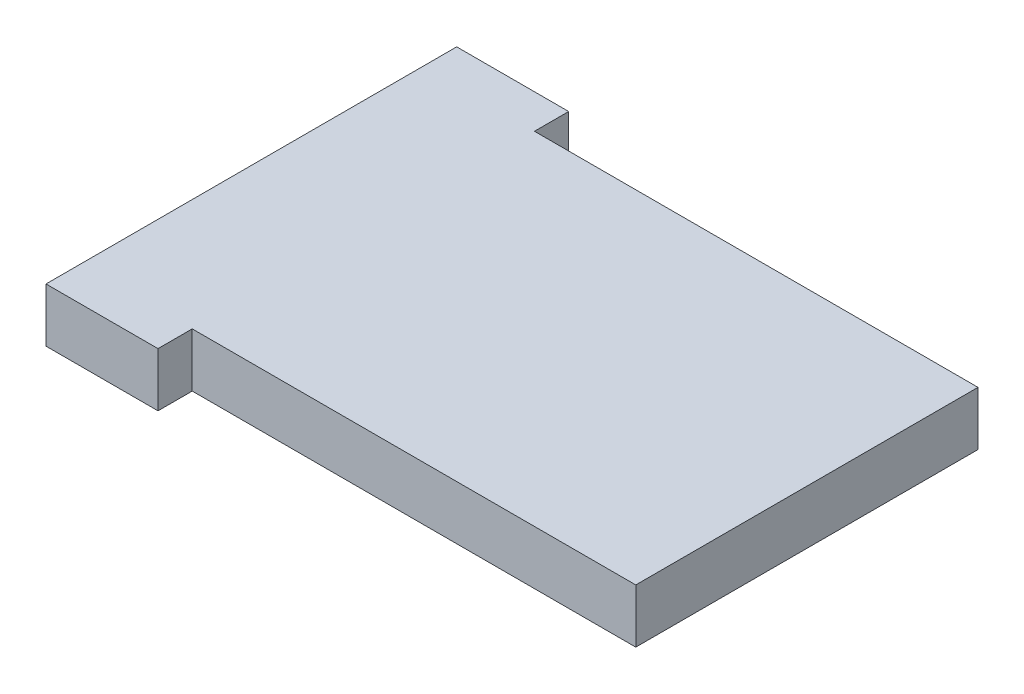
ISO-10303-21;
HEADER;
FILE_DESCRIPTION(('STEP AP214'),'2;1');
FILE_NAME('part.step','',(''),(''),'','','');
FILE_SCHEMA(('AUTOMOTIVE_DESIGN { 1 0 10303 214 1 1 1 1 }'));
ENDSEC;
DATA;
#1=APPLICATION_CONTEXT('core data for automotive mechanical design processes');
#2=APPLICATION_PROTOCOL_DEFINITION('international standard','automotive_design',2000,#1);
#3=PRODUCT_CONTEXT('',#1,'mechanical');
#4=PRODUCT('Part','Part','',(#3));
#5=PRODUCT_RELATED_PRODUCT_CATEGORY('part','',(#4));
#6=PRODUCT_DEFINITION_FORMATION('','',#4);
#7=PRODUCT_DEFINITION_CONTEXT('part definition',#1,'design');
#8=PRODUCT_DEFINITION('design','',#6,#7);
#9=PRODUCT_DEFINITION_SHAPE('','',#8);
#10=(LENGTH_UNIT() NAMED_UNIT(*) SI_UNIT(.MILLI.,.METRE.));
#11=(NAMED_UNIT(*) PLANE_ANGLE_UNIT() SI_UNIT($,.RADIAN.));
#12=(NAMED_UNIT(*) SI_UNIT($,.STERADIAN.) SOLID_ANGLE_UNIT());
#13=UNCERTAINTY_MEASURE_WITH_UNIT(LENGTH_MEASURE(1.E-05),#10,'distance_accuracy_value','');
#14=(GEOMETRIC_REPRESENTATION_CONTEXT(3) GLOBAL_UNCERTAINTY_ASSIGNED_CONTEXT((#13)) GLOBAL_UNIT_ASSIGNED_CONTEXT((#10,
#11,#12)) REPRESENTATION_CONTEXT('',''));
#15=CARTESIAN_POINT('',(0.,0.,0.));
#16=DIRECTION('',(0.,0.,1.));
#17=DIRECTION('',(1.,0.,0.));
#18=AXIS2_PLACEMENT_3D('',#15,#16,#17);
#19=CARTESIAN_POINT('',(10.3910665813114,5.,-19.05));
#20=DIRECTION('',(0.,0.,1.));
#21=DIRECTION('',(1.,0.,0.));
#22=AXIS2_PLACEMENT_3D('',#19,#20,#21);
#23=PLANE('',#22);
#24=DIRECTION('',(-1.,0.,0.));
#25=VECTOR('',#24,1.);
#26=CARTESIAN_POINT('',(10.3910665813114,0.,-19.05));
#27=LINE('',#26,#25);
#28=CARTESIAN_POINT('',(10.3910665813114,0.,-19.05));
#29=VERTEX_POINT('',#28);
#30=CARTESIAN_POINT('',(0.,0.,-19.05));
#31=VERTEX_POINT('',#30);
#32=EDGE_CURVE('E129',#29,#31,#27,.T.);
#33=ORIENTED_EDGE('',*,*,#32,.T.);
#34=DIRECTION('',(0.,-1.,0.));
#35=VECTOR('',#34,1.);
#36=CARTESIAN_POINT('',(0.,5.,-19.05));
#37=LINE('',#36,#35);
#38=CARTESIAN_POINT('',(0.,5.,-19.05));
#39=VERTEX_POINT('',#38);
#40=EDGE_CURVE('E11',#39,#31,#37,.T.);
#41=ORIENTED_EDGE('',*,*,#40,.F.);
#42=DIRECTION('',(-1.,0.,0.));
#43=VECTOR('',#42,1.);
#44=CARTESIAN_POINT('',(10.3910665813114,5.,-19.05));
#45=LINE('',#44,#43);
#46=CARTESIAN_POINT('',(10.3910665813114,5.,-19.05));
#47=VERTEX_POINT('',#46);
#48=EDGE_CURVE('E143',#47,#39,#45,.T.);
#49=ORIENTED_EDGE('',*,*,#48,.F.);
#50=DIRECTION('',(0.,-1.,0.));
#51=VECTOR('',#50,1.);
#52=CARTESIAN_POINT('',(10.3910665813114,5.,-19.05));
#53=LINE('',#52,#51);
#54=EDGE_CURVE('E125',#47,#29,#53,.T.);
#55=ORIENTED_EDGE('',*,*,#54,.T.);
#56=EDGE_LOOP('',(#33,#41,#49,#55));
#57=FACE_BOUND('',#56,.T.);
#58=ADVANCED_FACE('F33',(#57),#23,.F.);
#59=CARTESIAN_POINT('',(0.,5.,-19.05));
#60=DIRECTION('',(1.,0.,0.));
#61=DIRECTION('',(0.,0.,-1.));
#62=AXIS2_PLACEMENT_3D('',#59,#60,#61);
#63=PLANE('',#62);
#64=DIRECTION('',(0.,0.,1.));
#65=VECTOR('',#64,1.);
#66=CARTESIAN_POINT('',(0.,0.,-19.05));
#67=LINE('',#66,#65);
#68=CARTESIAN_POINT('',(0.,0.,19.05));
#69=VERTEX_POINT('',#68);
#70=EDGE_CURVE('E132',#31,#69,#67,.T.);
#71=ORIENTED_EDGE('',*,*,#70,.T.);
#72=DIRECTION('',(0.,-1.,0.));
#73=VECTOR('',#72,1.);
#74=CARTESIAN_POINT('',(0.,5.,19.05));
#75=LINE('',#74,#73);
#76=CARTESIAN_POINT('',(0.,5.,19.05));
#77=VERTEX_POINT('',#76);
#78=EDGE_CURVE('E41',#77,#69,#75,.T.);
#79=ORIENTED_EDGE('',*,*,#78,.F.);
#80=DIRECTION('',(0.,0.,1.));
#81=VECTOR('',#80,1.);
#82=CARTESIAN_POINT('',(0.,5.,-19.05));
#83=LINE('',#82,#81);
#84=EDGE_CURVE('E92',#39,#77,#83,.T.);
#85=ORIENTED_EDGE('',*,*,#84,.F.);
#86=ORIENTED_EDGE('',*,*,#40,.T.);
#87=EDGE_LOOP('',(#71,#79,#85,#86));
#88=FACE_BOUND('',#87,.T.);
#89=ADVANCED_FACE('F178',(#88),#63,.F.);
#90=CARTESIAN_POINT('',(0.,5.,19.05));
#91=DIRECTION('',(0.,0.,-1.));
#92=DIRECTION('',(-1.,0.,0.));
#93=AXIS2_PLACEMENT_3D('',#90,#91,#92);
#94=PLANE('',#93);
#95=DIRECTION('',(1.,0.,0.));
#96=VECTOR('',#95,1.);
#97=CARTESIAN_POINT('',(0.,0.,19.05));
#98=LINE('',#97,#96);
#99=CARTESIAN_POINT('',(10.3910665813114,0.,19.05));
#100=VERTEX_POINT('',#99);
#101=EDGE_CURVE('E134',#69,#100,#98,.T.);
#102=ORIENTED_EDGE('',*,*,#101,.T.);
#103=DIRECTION('',(0.,-1.,0.));
#104=VECTOR('',#103,1.);
#105=CARTESIAN_POINT('',(10.3910665813114,5.,19.05));
#106=LINE('',#105,#104);
#107=CARTESIAN_POINT('',(10.3910665813114,5.,19.05));
#108=VERTEX_POINT('',#107);
#109=EDGE_CURVE('E150',#108,#100,#106,.T.);
#110=ORIENTED_EDGE('',*,*,#109,.F.);
#111=DIRECTION('',(1.,0.,0.));
#112=VECTOR('',#111,1.);
#113=CARTESIAN_POINT('',(0.,5.,19.05));
#114=LINE('',#113,#112);
#115=EDGE_CURVE('E158',#77,#108,#114,.T.);
#116=ORIENTED_EDGE('',*,*,#115,.F.);
#117=ORIENTED_EDGE('',*,*,#78,.T.);
#118=EDGE_LOOP('',(#102,#110,#116,#117));
#119=FACE_BOUND('',#118,.T.);
#120=ADVANCED_FACE('F156',(#119),#94,.F.);
#121=CARTESIAN_POINT('',(10.3910665813114,5.,19.05));
#122=DIRECTION('',(-1.,0.,0.));
#123=DIRECTION('',(0.,0.,1.));
#124=AXIS2_PLACEMENT_3D('',#121,#122,#123);
#125=PLANE('',#124);
#126=DIRECTION('',(0.,0.,-1.));
#127=VECTOR('',#126,1.);
#128=CARTESIAN_POINT('',(10.3910665813114,0.,19.05));
#129=LINE('',#128,#127);
#130=CARTESIAN_POINT('',(10.3910665813114,0.,15.875));
#131=VERTEX_POINT('',#130);
#132=EDGE_CURVE('E136',#100,#131,#129,.T.);
#133=ORIENTED_EDGE('',*,*,#132,.T.);
#134=DIRECTION('',(0.,-1.,0.));
#135=VECTOR('',#134,1.);
#136=CARTESIAN_POINT('',(10.3910665813114,5.,15.875));
#137=LINE('',#136,#135);
#138=CARTESIAN_POINT('',(10.3910665813114,5.,15.875));
#139=VERTEX_POINT('',#138);
#140=EDGE_CURVE('E147',#139,#131,#137,.T.);
#141=ORIENTED_EDGE('',*,*,#140,.F.);
#142=DIRECTION('',(0.,0.,-1.));
#143=VECTOR('',#142,1.);
#144=CARTESIAN_POINT('',(10.3910665813114,5.,19.05));
#145=LINE('',#144,#143);
#146=EDGE_CURVE('E170',#108,#139,#145,.T.);
#147=ORIENTED_EDGE('',*,*,#146,.F.);
#148=ORIENTED_EDGE('',*,*,#109,.T.);
#149=EDGE_LOOP('',(#133,#141,#147,#148));
#150=FACE_BOUND('',#149,.T.);
#151=ADVANCED_FACE('F166',(#150),#125,.F.);
#152=CARTESIAN_POINT('',(10.3910665813114,5.,15.875));
#153=DIRECTION('',(0.,0.,-1.));
#154=DIRECTION('',(-1.,0.,0.));
#155=AXIS2_PLACEMENT_3D('',#152,#153,#154);
#156=PLANE('',#155);
#157=DIRECTION('',(1.,0.,0.));
#158=VECTOR('',#157,1.);
#159=CARTESIAN_POINT('',(10.3910665813114,0.,15.875));
#160=LINE('',#159,#158);
#161=CARTESIAN_POINT('',(51.5385868483041,0.,15.875));
#162=VERTEX_POINT('',#161);
#163=EDGE_CURVE('E138',#131,#162,#160,.T.);
#164=ORIENTED_EDGE('',*,*,#163,.T.);
#165=DIRECTION('',(0.,-1.,0.));
#166=VECTOR('',#165,1.);
#167=CARTESIAN_POINT('',(51.5385868483041,5.,15.875));
#168=LINE('',#167,#166);
#169=CARTESIAN_POINT('',(51.5385868483041,5.,15.875));
#170=VERTEX_POINT('',#169);
#171=EDGE_CURVE('E120',#170,#162,#168,.T.);
#172=ORIENTED_EDGE('',*,*,#171,.F.);
#173=DIRECTION('',(1.,0.,0.));
#174=VECTOR('',#173,1.);
#175=CARTESIAN_POINT('',(10.3910665813114,5.,15.875));
#176=LINE('',#175,#174);
#177=EDGE_CURVE('E111',#139,#170,#176,.T.);
#178=ORIENTED_EDGE('',*,*,#177,.F.);
#179=ORIENTED_EDGE('',*,*,#140,.T.);
#180=EDGE_LOOP('',(#164,#172,#178,#179));
#181=FACE_BOUND('',#180,.T.);
#182=ADVANCED_FACE('F169',(#181),#156,.F.);
#183=CARTESIAN_POINT('',(51.5385868483041,5.,15.875));
#184=DIRECTION('',(-1.,0.,0.));
#185=DIRECTION('',(0.,0.,1.));
#186=AXIS2_PLACEMENT_3D('',#183,#184,#185);
#187=PLANE('',#186);
#188=DIRECTION('',(0.,0.,-1.));
#189=VECTOR('',#188,1.);
#190=CARTESIAN_POINT('',(51.5385868483041,0.,15.875));
#191=LINE('',#190,#189);
#192=CARTESIAN_POINT('',(51.5385868483041,0.,-15.875));
#193=VERTEX_POINT('',#192);
#194=EDGE_CURVE('E119',#162,#193,#191,.T.);
#195=ORIENTED_EDGE('',*,*,#194,.T.);
#196=DIRECTION('',(0.,-1.,0.));
#197=VECTOR('',#196,1.);
#198=CARTESIAN_POINT('',(51.5385868483041,5.,-15.875));
#199=LINE('',#198,#197);
#200=CARTESIAN_POINT('',(51.5385868483041,5.,-15.875));
#201=VERTEX_POINT('',#200);
#202=EDGE_CURVE('E116',#201,#193,#199,.T.);
#203=ORIENTED_EDGE('',*,*,#202,.F.);
#204=DIRECTION('',(0.,0.,-1.));
#205=VECTOR('',#204,1.);
#206=CARTESIAN_POINT('',(51.5385868483041,5.,15.875));
#207=LINE('',#206,#205);
#208=EDGE_CURVE('E105',#170,#201,#207,.T.);
#209=ORIENTED_EDGE('',*,*,#208,.F.);
#210=ORIENTED_EDGE('',*,*,#171,.T.);
#211=EDGE_LOOP('',(#195,#203,#209,#210));
#212=FACE_BOUND('',#211,.T.);
#213=ADVANCED_FACE('F117',(#212),#187,.F.);
#214=CARTESIAN_POINT('',(51.5385868483041,5.,-15.875));
#215=DIRECTION('',(0.,0.,1.));
#216=DIRECTION('',(1.,0.,0.));
#217=AXIS2_PLACEMENT_3D('',#214,#215,#216);
#218=PLANE('',#217);
#219=DIRECTION('',(-1.,0.,0.));
#220=VECTOR('',#219,1.);
#221=CARTESIAN_POINT('',(51.5385868483041,0.,-15.875));
#222=LINE('',#221,#220);
#223=CARTESIAN_POINT('',(10.3910665813114,0.,-15.875));
#224=VERTEX_POINT('',#223);
#225=EDGE_CURVE('E78',#193,#224,#222,.T.);
#226=ORIENTED_EDGE('',*,*,#225,.T.);
#227=DIRECTION('',(0.,-1.,0.));
#228=VECTOR('',#227,1.);
#229=CARTESIAN_POINT('',(10.3910665813114,5.,-15.875));
#230=LINE('',#229,#228);
#231=CARTESIAN_POINT('',(10.3910665813114,5.,-15.875));
#232=VERTEX_POINT('',#231);
#233=EDGE_CURVE('E121',#232,#224,#230,.T.);
#234=ORIENTED_EDGE('',*,*,#233,.F.);
#235=DIRECTION('',(-1.,0.,0.));
#236=VECTOR('',#235,1.);
#237=CARTESIAN_POINT('',(51.5385868483041,5.,-15.875));
#238=LINE('',#237,#236);
#239=EDGE_CURVE('E109',#201,#232,#238,.T.);
#240=ORIENTED_EDGE('',*,*,#239,.F.);
#241=ORIENTED_EDGE('',*,*,#202,.T.);
#242=EDGE_LOOP('',(#226,#234,#240,#241));
#243=FACE_BOUND('',#242,.T.);
#244=ADVANCED_FACE('F123',(#243),#218,.F.);
#245=CARTESIAN_POINT('',(10.3910665813114,5.,-15.875));
#246=DIRECTION('',(-1.,0.,0.));
#247=DIRECTION('',(0.,0.,1.));
#248=AXIS2_PLACEMENT_3D('',#245,#246,#247);
#249=PLANE('',#248);
#250=DIRECTION('',(0.,0.,-1.));
#251=VECTOR('',#250,1.);
#252=CARTESIAN_POINT('',(10.3910665813114,0.,-15.875));
#253=LINE('',#252,#251);
#254=EDGE_CURVE('E84',#224,#29,#253,.T.);
#255=ORIENTED_EDGE('',*,*,#254,.T.);
#256=ORIENTED_EDGE('',*,*,#54,.F.);
#257=DIRECTION('',(0.,0.,-1.));
#258=VECTOR('',#257,1.);
#259=CARTESIAN_POINT('',(10.3910665813114,5.,-15.875));
#260=LINE('',#259,#258);
#261=EDGE_CURVE('E49',#232,#47,#260,.T.);
#262=ORIENTED_EDGE('',*,*,#261,.F.);
#263=ORIENTED_EDGE('',*,*,#233,.T.);
#264=EDGE_LOOP('',(#255,#256,#262,#263));
#265=FACE_BOUND('',#264,.T.);
#266=ADVANCED_FACE('F194',(#265),#249,.F.);
#267=CARTESIAN_POINT('',(0.,5.,0.));
#268=DIRECTION('',(0.,1.,0.));
#269=DIRECTION('',(0.,0.,1.));
#270=AXIS2_PLACEMENT_3D('',#267,#268,#269);
#271=PLANE('',#270);
#272=ORIENTED_EDGE('',*,*,#48,.T.);
#273=ORIENTED_EDGE('',*,*,#84,.T.);
#274=ORIENTED_EDGE('',*,*,#115,.T.);
#275=ORIENTED_EDGE('',*,*,#146,.T.);
#276=ORIENTED_EDGE('',*,*,#177,.T.);
#277=ORIENTED_EDGE('',*,*,#208,.T.);
#278=ORIENTED_EDGE('',*,*,#239,.T.);
#279=ORIENTED_EDGE('',*,*,#261,.T.);
#280=EDGE_LOOP('',(#272,#273,#274,#275,#276,#277,#278,#279));
#281=FACE_BOUND('',#280,.T.);
#282=ADVANCED_FACE('F107',(#281),#271,.T.);
#283=CARTESIAN_POINT('',(0.,0.,0.));
#284=DIRECTION('',(0.,1.,0.));
#285=DIRECTION('',(0.,0.,1.));
#286=AXIS2_PLACEMENT_3D('',#283,#284,#285);
#287=PLANE('',#286);
#288=ORIENTED_EDGE('',*,*,#32,.F.);
#289=ORIENTED_EDGE('',*,*,#254,.F.);
#290=ORIENTED_EDGE('',*,*,#225,.F.);
#291=ORIENTED_EDGE('',*,*,#194,.F.);
#292=ORIENTED_EDGE('',*,*,#163,.F.);
#293=ORIENTED_EDGE('',*,*,#132,.F.);
#294=ORIENTED_EDGE('',*,*,#101,.F.);
#295=ORIENTED_EDGE('',*,*,#70,.F.);
#296=EDGE_LOOP('',(#288,#289,#290,#291,#292,#293,#294,#295));
#297=FACE_BOUND('',#296,.T.);
#298=ADVANCED_FACE('F162',(#297),#287,.F.);
#299=CLOSED_SHELL('',(#58,#89,#120,#151,#182,#213,#244,#266,#282,#298));
#300=MANIFOLD_SOLID_BREP('B2',#299);
#301=ADVANCED_BREP_SHAPE_REPRESENTATION('',(#18,#300),#14);
#302=SHAPE_DEFINITION_REPRESENTATION(#9,#301);
ENDSEC;
END-ISO-10303-21;
